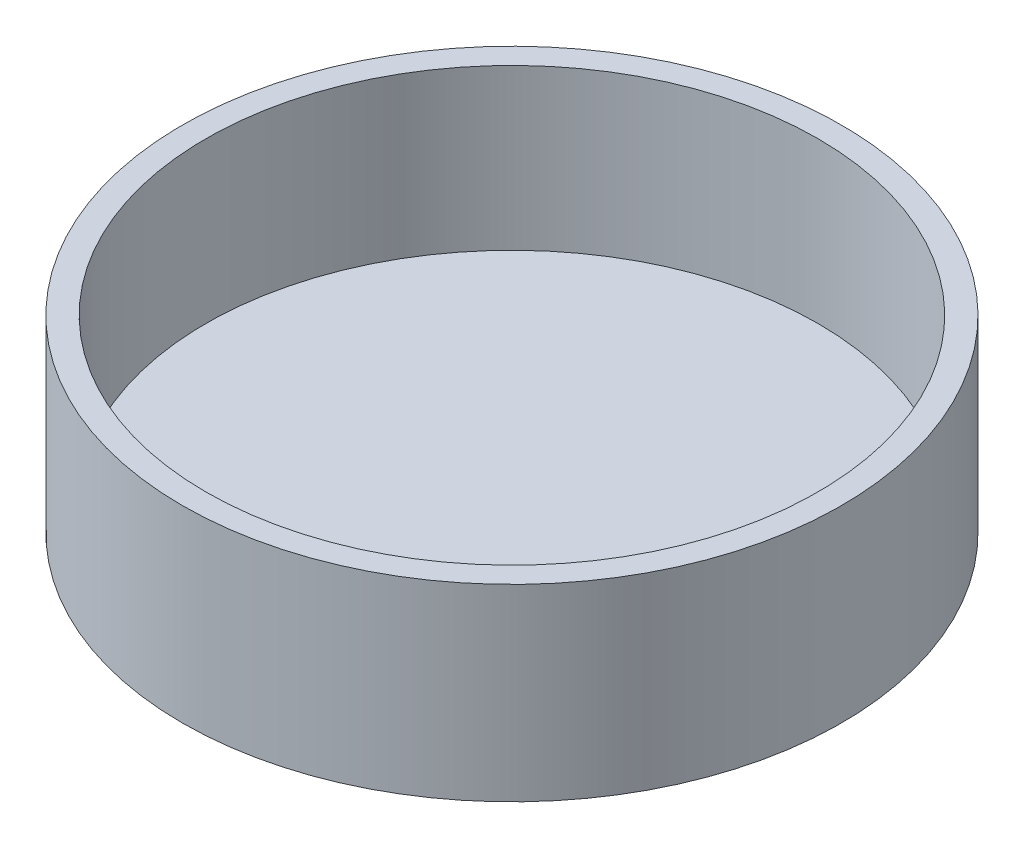
ISO-10303-21;
HEADER;
FILE_DESCRIPTION(('STEP AP214'),'2;1');
FILE_NAME('part.step','',(''),(''),'','','');
FILE_SCHEMA(('AUTOMOTIVE_DESIGN { 1 0 10303 214 1 1 1 1 }'));
ENDSEC;
DATA;
#1=APPLICATION_CONTEXT('core data for automotive mechanical design processes');
#2=APPLICATION_PROTOCOL_DEFINITION('international standard','automotive_design',2000,#1);
#3=PRODUCT_CONTEXT('',#1,'mechanical');
#4=PRODUCT('Part','Part','',(#3));
#5=PRODUCT_RELATED_PRODUCT_CATEGORY('part','',(#4));
#6=PRODUCT_DEFINITION_FORMATION('','',#4);
#7=PRODUCT_DEFINITION_CONTEXT('part definition',#1,'design');
#8=PRODUCT_DEFINITION('design','',#6,#7);
#9=PRODUCT_DEFINITION_SHAPE('','',#8);
#10=(LENGTH_UNIT() NAMED_UNIT(*) SI_UNIT(.MILLI.,.METRE.));
#11=(NAMED_UNIT(*) PLANE_ANGLE_UNIT() SI_UNIT($,.RADIAN.));
#12=(NAMED_UNIT(*) SI_UNIT($,.STERADIAN.) SOLID_ANGLE_UNIT());
#13=UNCERTAINTY_MEASURE_WITH_UNIT(LENGTH_MEASURE(1.E-05),#10,'distance_accuracy_value','');
#14=(GEOMETRIC_REPRESENTATION_CONTEXT(3) GLOBAL_UNCERTAINTY_ASSIGNED_CONTEXT((#13)) GLOBAL_UNIT_ASSIGNED_CONTEXT((#10,
#11,#12)) REPRESENTATION_CONTEXT('',''));
#15=CARTESIAN_POINT('',(0.,0.,0.));
#16=DIRECTION('',(0.,0.,1.));
#17=DIRECTION('',(1.,0.,0.));
#18=AXIS2_PLACEMENT_3D('',#15,#16,#17);
#19=CARTESIAN_POINT('',(0.,-20.,0.));
#20=DIRECTION('',(0.,1.,0.));
#21=DIRECTION('',(0.,0.,1.));
#22=AXIS2_PLACEMENT_3D('',#19,#20,#21);
#23=CYLINDRICAL_SURFACE('',#22,32.5);
#24=CARTESIAN_POINT('',(0.,0.,0.));
#25=DIRECTION('',(0.,1.,0.));
#26=DIRECTION('',(0.,0.,1.));
#27=AXIS2_PLACEMENT_3D('',#24,#25,#26);
#28=CIRCLE('',#27,32.5);
#29=CARTESIAN_POINT('',(0.,0.,32.5));
#30=VERTEX_POINT('',#29);
#31=EDGE_CURVE('E52',#30,#30,#28,.T.);
#32=ORIENTED_EDGE('',*,*,#31,.T.);
#33=EDGE_LOOP('',(#32));
#34=FACE_BOUND('',#33,.T.);
#35=CARTESIAN_POINT('',(0.,-17.,0.));
#36=DIRECTION('',(0.,-1.,0.));
#37=DIRECTION('',(0.,0.,-1.));
#38=AXIS2_PLACEMENT_3D('',#35,#36,#37);
#39=CIRCLE('',#38,32.5);
#40=CARTESIAN_POINT('',(0.,-17.,-32.5));
#41=VERTEX_POINT('',#40);
#42=EDGE_CURVE('E10',#41,#41,#39,.F.);
#43=ORIENTED_EDGE('',*,*,#42,.F.);
#44=EDGE_LOOP('',(#43));
#45=FACE_BOUND('',#44,.T.);
#46=ADVANCED_FACE('F40',(#34,#45),#23,.F.);
#47=CARTESIAN_POINT('',(0.,-20.,0.));
#48=DIRECTION('',(0.,1.,0.));
#49=DIRECTION('',(0.,0.,1.));
#50=AXIS2_PLACEMENT_3D('',#47,#48,#49);
#51=CYLINDRICAL_SURFACE('',#50,35.);
#52=CARTESIAN_POINT('',(0.,-20.,0.));
#53=DIRECTION('',(0.,1.,0.));
#54=DIRECTION('',(0.,0.,1.));
#55=AXIS2_PLACEMENT_3D('',#52,#53,#54);
#56=CIRCLE('',#55,35.);
#57=CARTESIAN_POINT('',(0.,-20.,35.));
#58=VERTEX_POINT('',#57);
#59=EDGE_CURVE('E42',#58,#58,#56,.T.);
#60=ORIENTED_EDGE('',*,*,#59,.T.);
#61=EDGE_LOOP('',(#60));
#62=FACE_BOUND('',#61,.T.);
#63=CARTESIAN_POINT('',(0.,0.,0.));
#64=DIRECTION('',(0.,1.,0.));
#65=DIRECTION('',(0.,0.,1.));
#66=AXIS2_PLACEMENT_3D('',#63,#64,#65);
#67=CIRCLE('',#66,35.);
#68=CARTESIAN_POINT('',(0.,0.,35.));
#69=VERTEX_POINT('',#68);
#70=EDGE_CURVE('E48',#69,#69,#67,.T.);
#71=ORIENTED_EDGE('',*,*,#70,.F.);
#72=EDGE_LOOP('',(#71));
#73=FACE_BOUND('',#72,.T.);
#74=ADVANCED_FACE('F39',(#62,#73),#51,.T.);
#75=CARTESIAN_POINT('',(0.,-20.,0.));
#76=DIRECTION('',(0.,1.,0.));
#77=DIRECTION('',(0.,0.,1.));
#78=AXIS2_PLACEMENT_3D('',#75,#76,#77);
#79=PLANE('',#78);
#80=ORIENTED_EDGE('',*,*,#59,.F.);
#81=EDGE_LOOP('',(#80));
#82=FACE_BOUND('',#81,.T.);
#83=ADVANCED_FACE('F62',(#82),#79,.F.);
#84=CARTESIAN_POINT('',(0.,0.,0.));
#85=DIRECTION('',(0.,1.,0.));
#86=DIRECTION('',(0.,0.,1.));
#87=AXIS2_PLACEMENT_3D('',#84,#85,#86);
#88=PLANE('',#87);
#89=ORIENTED_EDGE('',*,*,#31,.F.);
#90=EDGE_LOOP('',(#89));
#91=FACE_BOUND('',#90,.T.);
#92=ORIENTED_EDGE('',*,*,#70,.T.);
#93=EDGE_LOOP('',(#92));
#94=FACE_BOUND('',#93,.T.);
#95=ADVANCED_FACE('F58',(#91,#94),#88,.T.);
#96=CARTESIAN_POINT('',(0.,-17.,0.));
#97=DIRECTION('',(0.,-1.,0.));
#98=DIRECTION('',(0.,0.,-1.));
#99=AXIS2_PLACEMENT_3D('',#96,#97,#98);
#100=PLANE('',#99);
#101=ORIENTED_EDGE('',*,*,#42,.T.);
#102=EDGE_LOOP('',(#101));
#103=FACE_BOUND('',#102,.T.);
#104=ADVANCED_FACE('F61',(#103),#100,.F.);
#105=CLOSED_SHELL('',(#46,#74,#83,#95,#104));
#106=MANIFOLD_SOLID_BREP('B2',#105);
#107=ADVANCED_BREP_SHAPE_REPRESENTATION('',(#18,#106),#14);
#108=SHAPE_DEFINITION_REPRESENTATION(#9,#107);
ENDSEC;
END-ISO-10303-21;
